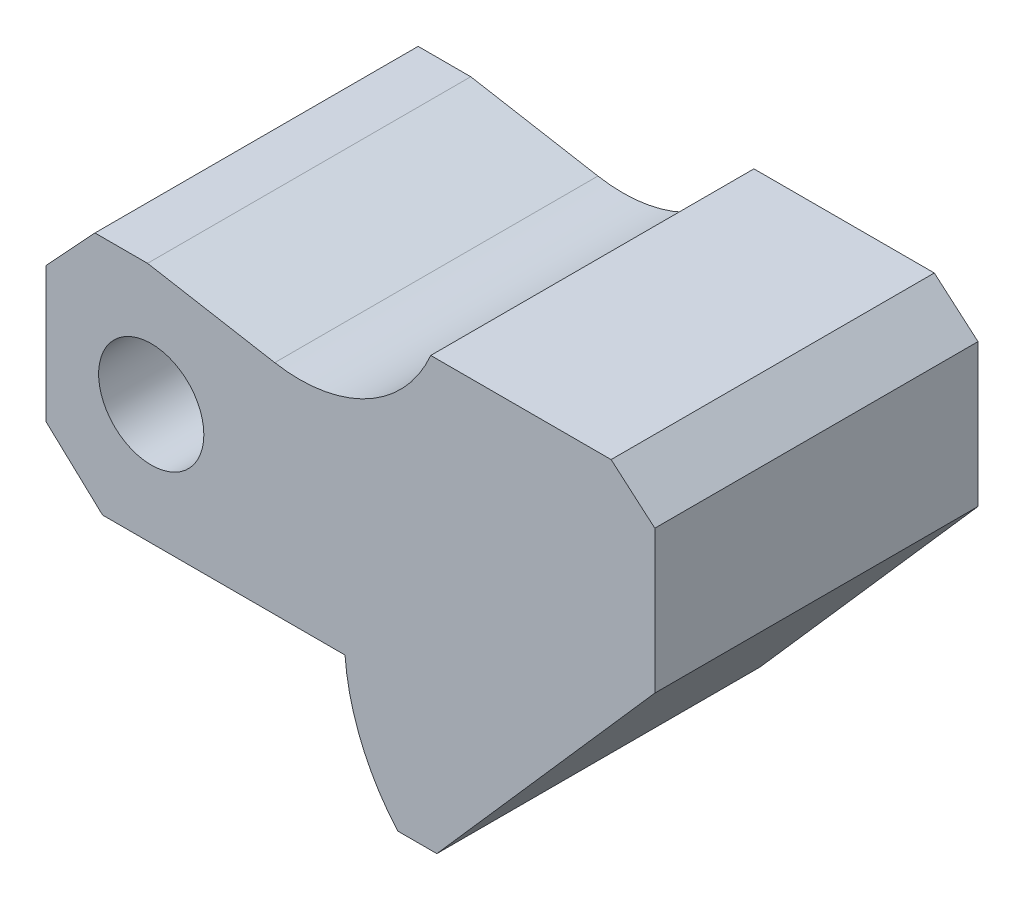
ISO-10303-21;
HEADER;
FILE_DESCRIPTION(('STEP AP214'),'2;1');
FILE_NAME('part.step','',(''),(''),'','','');
FILE_SCHEMA(('AUTOMOTIVE_DESIGN { 1 0 10303 214 1 1 1 1 }'));
ENDSEC;
DATA;
#1=APPLICATION_CONTEXT('core data for automotive mechanical design processes');
#2=APPLICATION_PROTOCOL_DEFINITION('international standard','automotive_design',2000,#1);
#3=PRODUCT_CONTEXT('',#1,'mechanical');
#4=PRODUCT('Part','Part','',(#3));
#5=PRODUCT_RELATED_PRODUCT_CATEGORY('part','',(#4));
#6=PRODUCT_DEFINITION_FORMATION('','',#4);
#7=PRODUCT_DEFINITION_CONTEXT('part definition',#1,'design');
#8=PRODUCT_DEFINITION('design','',#6,#7);
#9=PRODUCT_DEFINITION_SHAPE('','',#8);
#10=(LENGTH_UNIT() NAMED_UNIT(*) SI_UNIT(.MILLI.,.METRE.));
#11=(NAMED_UNIT(*) PLANE_ANGLE_UNIT() SI_UNIT($,.RADIAN.));
#12=(NAMED_UNIT(*) SI_UNIT($,.STERADIAN.) SOLID_ANGLE_UNIT());
#13=UNCERTAINTY_MEASURE_WITH_UNIT(LENGTH_MEASURE(1.E-05),#10,'distance_accuracy_value','');
#14=(GEOMETRIC_REPRESENTATION_CONTEXT(3) GLOBAL_UNCERTAINTY_ASSIGNED_CONTEXT((#13)) GLOBAL_UNIT_ASSIGNED_CONTEXT((#10,
#11,#12)) REPRESENTATION_CONTEXT('',''));
#15=CARTESIAN_POINT('',(0.,0.,0.));
#16=DIRECTION('',(0.,0.,1.));
#17=DIRECTION('',(1.,0.,0.));
#18=AXIS2_PLACEMENT_3D('',#15,#16,#17);
#19=CARTESIAN_POINT('',(0.,-12.1442865758826,43.));
#20=DIRECTION('',(0.,1.,0.));
#21=DIRECTION('',(-1.,0.,0.));
#22=AXIS2_PLACEMENT_3D('',#19,#20,#21);
#23=PLANE('',#22);
#24=DIRECTION('',(1.,0.,0.));
#25=VECTOR('',#24,1.);
#26=CARTESIAN_POINT('',(0.,-12.1442865758826,0.));
#27=LINE('',#26,#25);
#28=CARTESIAN_POINT('',(-18.7662638719274,-12.1442865758826,0.));
#29=VERTEX_POINT('',#28);
#30=CARTESIAN_POINT('',(13.4919473188051,-12.1442865758826,0.));
#31=VERTEX_POINT('',#30);
#32=EDGE_CURVE('E178',#29,#31,#27,.T.);
#33=ORIENTED_EDGE('',*,*,#32,.T.);
#34=DIRECTION('',(0.,0.,-1.));
#35=VECTOR('',#34,1.);
#36=CARTESIAN_POINT('',(13.4919473188051,-12.1442865758826,43.));
#37=LINE('',#36,#35);
#38=CARTESIAN_POINT('',(13.4919473188051,-12.1442865758826,43.));
#39=VERTEX_POINT('',#38);
#40=EDGE_CURVE('E11',#39,#31,#37,.T.);
#41=ORIENTED_EDGE('',*,*,#40,.F.);
#42=DIRECTION('',(1.,0.,0.));
#43=VECTOR('',#42,1.);
#44=CARTESIAN_POINT('',(0.,-12.1442865758826,43.));
#45=LINE('',#44,#43);
#46=CARTESIAN_POINT('',(-18.7662638719274,-12.1442865758826,43.));
#47=VERTEX_POINT('',#46);
#48=EDGE_CURVE('E279',#47,#39,#45,.T.);
#49=ORIENTED_EDGE('',*,*,#48,.F.);
#50=DIRECTION('',(0.,0.,-1.));
#51=VECTOR('',#50,1.);
#52=CARTESIAN_POINT('',(-18.7662638719274,-12.1442865758826,43.));
#53=LINE('',#52,#51);
#54=EDGE_CURVE('E173',#47,#29,#53,.T.);
#55=ORIENTED_EDGE('',*,*,#54,.T.);
#56=EDGE_LOOP('',(#33,#41,#49,#55));
#57=FACE_BOUND('',#56,.T.);
#58=ADVANCED_FACE('F39',(#57),#23,.F.);
#59=CARTESIAN_POINT('',(42.4064566584593,-9.91916868079168,43.));
#60=DIRECTION('',(0.,0.,-1.));
#61=DIRECTION('',(-1.,0.,0.));
#62=AXIS2_PLACEMENT_3D('',#59,#60,#61);
#63=CYLINDRICAL_SURFACE('',#62,29.);
#64=CARTESIAN_POINT('',(42.4064566584593,-9.91916868079168,0.));
#65=DIRECTION('',(0.,0.,1.));
#66=DIRECTION('',(1.,0.,0.));
#67=AXIS2_PLACEMENT_3D('',#64,#65,#66);
#68=CIRCLE('',#67,29.);
#69=CARTESIAN_POINT('',(20.4975543582526,-28.9191686807917,0.));
#70=VERTEX_POINT('',#69);
#71=EDGE_CURVE('E182',#31,#70,#68,.T.);
#72=ORIENTED_EDGE('',*,*,#71,.T.);
#73=DIRECTION('',(0.,0.,-1.));
#74=VECTOR('',#73,1.);
#75=CARTESIAN_POINT('',(20.4975543582526,-28.9191686807917,43.));
#76=LINE('',#75,#74);
#77=CARTESIAN_POINT('',(20.4975543582526,-28.9191686807917,43.));
#78=VERTEX_POINT('',#77);
#79=EDGE_CURVE('E49',#78,#70,#76,.T.);
#80=ORIENTED_EDGE('',*,*,#79,.F.);
#81=CARTESIAN_POINT('',(42.4064566584593,-9.91916868079168,43.));
#82=DIRECTION('',(0.,0.,1.));
#83=DIRECTION('',(1.,0.,0.));
#84=AXIS2_PLACEMENT_3D('',#81,#82,#83);
#85=CIRCLE('',#84,29.);
#86=EDGE_CURVE('E114',#39,#78,#85,.T.);
#87=ORIENTED_EDGE('',*,*,#86,.F.);
#88=ORIENTED_EDGE('',*,*,#40,.T.);
#89=EDGE_LOOP('',(#72,#80,#87,#88));
#90=FACE_BOUND('',#89,.T.);
#91=ADVANCED_FACE('F258',(#90),#63,.T.);
#92=CARTESIAN_POINT('',(0.,-28.9191686807917,43.));
#93=DIRECTION('',(0.,-1.,0.));
#94=DIRECTION('',(0.,0.,-1.));
#95=AXIS2_PLACEMENT_3D('',#92,#93,#94);
#96=PLANE('',#95);
#97=DIRECTION('',(-1.,0.,0.));
#98=VECTOR('',#97,1.);
#99=CARTESIAN_POINT('',(0.,-28.9191686807917,0.));
#100=LINE('',#99,#98);
#101=CARTESIAN_POINT('',(25.7094869614896,-28.9191686807917,0.));
#102=VERTEX_POINT('',#101);
#103=EDGE_CURVE('E186',#102,#70,#100,.T.);
#104=ORIENTED_EDGE('',*,*,#103,.F.);
#105=DIRECTION('',(0.,0.,-1.));
#106=VECTOR('',#105,1.);
#107=CARTESIAN_POINT('',(25.7094869614896,-28.9191686807917,43.));
#108=LINE('',#107,#106);
#109=CARTESIAN_POINT('',(25.7094869614896,-28.9191686807917,43.));
#110=VERTEX_POINT('',#109);
#111=EDGE_CURVE('E249',#110,#102,#108,.T.);
#112=ORIENTED_EDGE('',*,*,#111,.F.);
#113=DIRECTION('',(-1.,0.,0.));
#114=VECTOR('',#113,1.);
#115=CARTESIAN_POINT('',(0.,-28.9191686807917,43.));
#116=LINE('',#115,#114);
#117=EDGE_CURVE('E257',#110,#78,#116,.T.);
#118=ORIENTED_EDGE('',*,*,#117,.T.);
#119=ORIENTED_EDGE('',*,*,#79,.T.);
#120=EDGE_LOOP('',(#104,#112,#118,#119));
#121=FACE_BOUND('',#120,.T.);
#122=ADVANCED_FACE('F255',(#121),#96,.T.);
#123=CARTESIAN_POINT('',(28.8462568541864,-25.3497408718608,43.));
#124=DIRECTION('',(0.751164898449876,-0.660114607728679,0.));
#125=DIRECTION('',(0.660114607728679,0.751164898449876,0.));
#126=AXIS2_PLACEMENT_3D('',#123,#124,#125);
#127=PLANE('',#126);
#128=DIRECTION('',(-0.660114607728679,-0.751164898449876,0.));
#129=VECTOR('',#128,1.);
#130=CARTESIAN_POINT('',(28.8462568541864,-25.3497408718608,0.));
#131=LINE('',#130,#129);
#132=CARTESIAN_POINT('',(54.7094869614896,4.08083131920833,0.));
#133=VERTEX_POINT('',#132);
#134=EDGE_CURVE('E190',#133,#102,#131,.T.);
#135=ORIENTED_EDGE('',*,*,#134,.F.);
#136=DIRECTION('',(0.,0.,-1.));
#137=VECTOR('',#136,1.);
#138=CARTESIAN_POINT('',(54.7094869614896,4.08083131920833,43.));
#139=LINE('',#138,#137);
#140=CARTESIAN_POINT('',(54.7094869614896,4.08083131920833,43.));
#141=VERTEX_POINT('',#140);
#142=EDGE_CURVE('E246',#141,#133,#139,.T.);
#143=ORIENTED_EDGE('',*,*,#142,.F.);
#144=DIRECTION('',(-0.660114607728679,-0.751164898449876,0.));
#145=VECTOR('',#144,1.);
#146=CARTESIAN_POINT('',(28.8462568541864,-25.3497408718608,43.));
#147=LINE('',#146,#145);
#148=EDGE_CURVE('E270',#141,#110,#147,.T.);
#149=ORIENTED_EDGE('',*,*,#148,.T.);
#150=ORIENTED_EDGE('',*,*,#111,.T.);
#151=EDGE_LOOP('',(#135,#143,#149,#150));
#152=FACE_BOUND('',#151,.T.);
#153=ADVANCED_FACE('F267',(#152),#127,.T.);
#154=CARTESIAN_POINT('',(54.7094869614896,0.,43.));
#155=DIRECTION('',(1.,0.,0.));
#156=DIRECTION('',(0.,0.,-1.));
#157=AXIS2_PLACEMENT_3D('',#154,#155,#156);
#158=PLANE('',#157);
#159=DIRECTION('',(0.,-1.,0.));
#160=VECTOR('',#159,1.);
#161=CARTESIAN_POINT('',(54.7094869614896,0.,0.));
#162=LINE('',#161,#160);
#163=CARTESIAN_POINT('',(54.7094869614896,23.0808313192083,0.));
#164=VERTEX_POINT('',#163);
#165=EDGE_CURVE('E194',#164,#133,#162,.T.);
#166=ORIENTED_EDGE('',*,*,#165,.F.);
#167=DIRECTION('',(0.,0.,-1.));
#168=VECTOR('',#167,1.);
#169=CARTESIAN_POINT('',(54.7094869614896,23.0808313192083,43.));
#170=LINE('',#169,#168);
#171=CARTESIAN_POINT('',(54.7094869614896,23.0808313192083,43.));
#172=VERTEX_POINT('',#171);
#173=EDGE_CURVE('E243',#172,#164,#170,.T.);
#174=ORIENTED_EDGE('',*,*,#173,.F.);
#175=DIRECTION('',(0.,-1.,0.));
#176=VECTOR('',#175,1.);
#177=CARTESIAN_POINT('',(54.7094869614896,0.,43.));
#178=LINE('',#177,#176);
#179=EDGE_CURVE('E277',#172,#141,#178,.T.);
#180=ORIENTED_EDGE('',*,*,#179,.T.);
#181=ORIENTED_EDGE('',*,*,#142,.T.);
#182=EDGE_LOOP('',(#166,#174,#180,#181));
#183=FACE_BOUND('',#182,.T.);
#184=ADVANCED_FACE('F328',(#183),#158,.T.);
#185=CARTESIAN_POINT('',(34.6763728894969,40.3129186319679,43.));
#186=DIRECTION('',(-0.652117780038028,-0.758117669599037,0.));
#187=DIRECTION('',(0.758117669599037,-0.652117780038028,0.));
#188=AXIS2_PLACEMENT_3D('',#185,#186,#187);
#189=PLANE('',#188);
#190=DIRECTION('',(-0.758117669599037,0.652117780038028,0.));
#191=VECTOR('',#190,1.);
#192=CARTESIAN_POINT('',(34.6763728894969,40.3129186319679,0.));
#193=LINE('',#192,#191);
#194=CARTESIAN_POINT('',(48.8967511888595,28.0808313192083,0.));
#195=VERTEX_POINT('',#194);
#196=EDGE_CURVE('E198',#164,#195,#193,.T.);
#197=ORIENTED_EDGE('',*,*,#196,.T.);
#198=DIRECTION('',(0.,0.,-1.));
#199=VECTOR('',#198,1.);
#200=CARTESIAN_POINT('',(48.8967511888595,28.0808313192083,43.));
#201=LINE('',#200,#199);
#202=CARTESIAN_POINT('',(48.8967511888595,28.0808313192083,43.));
#203=VERTEX_POINT('',#202);
#204=EDGE_CURVE('E239',#203,#195,#201,.T.);
#205=ORIENTED_EDGE('',*,*,#204,.F.);
#206=DIRECTION('',(-0.758117669599037,0.652117780038028,0.));
#207=VECTOR('',#206,1.);
#208=CARTESIAN_POINT('',(34.6763728894969,40.3129186319679,43.));
#209=LINE('',#208,#207);
#210=EDGE_CURVE('E285',#172,#203,#209,.T.);
#211=ORIENTED_EDGE('',*,*,#210,.F.);
#212=ORIENTED_EDGE('',*,*,#173,.T.);
#213=EDGE_LOOP('',(#197,#205,#211,#212));
#214=FACE_BOUND('',#213,.T.);
#215=ADVANCED_FACE('F331',(#214),#189,.F.);
#216=CARTESIAN_POINT('',(0.,28.0808313192083,43.));
#217=DIRECTION('',(0.,-1.,0.));
#218=DIRECTION('',(0.,0.,-1.));
#219=AXIS2_PLACEMENT_3D('',#216,#217,#218);
#220=PLANE('',#219);
#221=DIRECTION('',(-1.,0.,0.));
#222=VECTOR('',#221,1.);
#223=CARTESIAN_POINT('',(0.,28.0808313192083,0.));
#224=LINE('',#223,#222);
#225=CARTESIAN_POINT('',(24.8967511888595,28.0808313192083,0.));
#226=VERTEX_POINT('',#225);
#227=EDGE_CURVE('E201',#195,#226,#224,.T.);
#228=ORIENTED_EDGE('',*,*,#227,.T.);
#229=DIRECTION('',(0.,0.,-1.));
#230=VECTOR('',#229,1.);
#231=CARTESIAN_POINT('',(24.8967511888595,28.0808313192083,43.));
#232=LINE('',#231,#230);
#233=CARTESIAN_POINT('',(24.8967511888595,28.0808313192083,43.));
#234=VERTEX_POINT('',#233);
#235=EDGE_CURVE('E236',#234,#226,#232,.T.);
#236=ORIENTED_EDGE('',*,*,#235,.F.);
#237=DIRECTION('',(-1.,0.,0.));
#238=VECTOR('',#237,1.);
#239=CARTESIAN_POINT('',(0.,28.0808313192083,43.));
#240=LINE('',#239,#238);
#241=EDGE_CURVE('E288',#203,#234,#240,.T.);
#242=ORIENTED_EDGE('',*,*,#241,.F.);
#243=ORIENTED_EDGE('',*,*,#204,.T.);
#244=EDGE_LOOP('',(#228,#236,#242,#243));
#245=FACE_BOUND('',#244,.T.);
#246=ADVANCED_FACE('F335',(#245),#220,.F.);
#247=CARTESIAN_POINT('',(7.44087013271377,35.5836452282489,43.));
#248=DIRECTION('',(0.,0.,-1.));
#249=DIRECTION('',(-1.,0.,0.));
#250=AXIS2_PLACEMENT_3D('',#247,#248,#249);
#251=CYLINDRICAL_SURFACE('',#250,19.);
#252=CARTESIAN_POINT('',(7.44087013271377,35.5836452282489,0.));
#253=DIRECTION('',(0.,0.,1.));
#254=DIRECTION('',(1.,0.,0.));
#255=AXIS2_PLACEMENT_3D('',#252,#253,#254);
#256=CIRCLE('',#255,19.);
#257=CARTESIAN_POINT('',(4.14155475704207,16.872297921017,0.));
#258=VERTEX_POINT('',#257);
#259=EDGE_CURVE('E205',#258,#226,#256,.T.);
#260=ORIENTED_EDGE('',*,*,#259,.F.);
#261=DIRECTION('',(0.,0.,-1.));
#262=VECTOR('',#261,1.);
#263=CARTESIAN_POINT('',(4.14155475704207,16.872297921017,43.));
#264=LINE('',#263,#262);
#265=CARTESIAN_POINT('',(4.14155475704207,16.872297921017,43.));
#266=VERTEX_POINT('',#265);
#267=EDGE_CURVE('E233',#266,#258,#264,.T.);
#268=ORIENTED_EDGE('',*,*,#267,.F.);
#269=CARTESIAN_POINT('',(7.44087013271377,35.5836452282489,43.));
#270=DIRECTION('',(0.,0.,1.));
#271=DIRECTION('',(1.,0.,0.));
#272=AXIS2_PLACEMENT_3D('',#269,#270,#271);
#273=CIRCLE('',#272,19.);
#274=EDGE_CURVE('E291',#266,#234,#273,.T.);
#275=ORIENTED_EDGE('',*,*,#274,.T.);
#276=ORIENTED_EDGE('',*,*,#235,.T.);
#277=EDGE_LOOP('',(#260,#268,#275,#276));
#278=FACE_BOUND('',#277,.T.);
#279=ADVANCED_FACE('F339',(#278),#251,.F.);
#280=CARTESIAN_POINT('',(3.01021603322426,17.0717834623464,43.));
#281=DIRECTION('',(0.173648177666931,0.984807753012208,0.));
#282=DIRECTION('',(-0.984807753012208,0.173648177666931,0.));
#283=AXIS2_PLACEMENT_3D('',#280,#281,#282);
#284=PLANE('',#283);
#285=DIRECTION('',(0.984807753012208,-0.173648177666931,0.));
#286=VECTOR('',#285,1.);
#287=CARTESIAN_POINT('',(3.01021603322426,17.0717834623464,0.));
#288=LINE('',#287,#286);
#289=CARTESIAN_POINT('',(-12.778235346057,19.8557134241174,0.));
#290=VERTEX_POINT('',#289);
#291=EDGE_CURVE('E209',#290,#258,#288,.T.);
#292=ORIENTED_EDGE('',*,*,#291,.F.);
#293=DIRECTION('',(0.,0.,-1.));
#294=VECTOR('',#293,1.);
#295=CARTESIAN_POINT('',(-12.778235346057,19.8557134241174,43.));
#296=LINE('',#295,#294);
#297=CARTESIAN_POINT('',(-12.778235346057,19.8557134241174,43.));
#298=VERTEX_POINT('',#297);
#299=EDGE_CURVE('E230',#298,#290,#296,.T.);
#300=ORIENTED_EDGE('',*,*,#299,.F.);
#301=DIRECTION('',(0.984807753012208,-0.173648177666931,0.));
#302=VECTOR('',#301,1.);
#303=CARTESIAN_POINT('',(3.01021603322426,17.0717834623464,43.));
#304=LINE('',#303,#302);
#305=EDGE_CURVE('E167',#298,#266,#304,.T.);
#306=ORIENTED_EDGE('',*,*,#305,.T.);
#307=ORIENTED_EDGE('',*,*,#267,.T.);
#308=EDGE_LOOP('',(#292,#300,#306,#307));
#309=FACE_BOUND('',#308,.T.);
#310=ADVANCED_FACE('F298',(#309),#284,.T.);
#311=CARTESIAN_POINT('',(0.,19.8557134241175,43.));
#312=DIRECTION('',(0.,1.,0.));
#313=DIRECTION('',(-1.,0.,0.));
#314=AXIS2_PLACEMENT_3D('',#311,#312,#313);
#315=PLANE('',#314);
#316=DIRECTION('',(1.,0.,0.));
#317=VECTOR('',#316,1.);
#318=CARTESIAN_POINT('',(0.,19.8557134241175,0.));
#319=LINE('',#318,#317);
#320=CARTESIAN_POINT('',(-19.778235346057,19.8557134241174,0.));
#321=VERTEX_POINT('',#320);
#322=EDGE_CURVE('E213',#321,#290,#319,.T.);
#323=ORIENTED_EDGE('',*,*,#322,.F.);
#324=DIRECTION('',(0.,0.,-1.));
#325=VECTOR('',#324,1.);
#326=CARTESIAN_POINT('',(-19.778235346057,19.8557134241174,43.));
#327=LINE('',#326,#325);
#328=CARTESIAN_POINT('',(-19.778235346057,19.8557134241174,43.));
#329=VERTEX_POINT('',#328);
#330=EDGE_CURVE('E152',#329,#321,#327,.T.);
#331=ORIENTED_EDGE('',*,*,#330,.F.);
#332=DIRECTION('',(1.,0.,0.));
#333=VECTOR('',#332,1.);
#334=CARTESIAN_POINT('',(0.,19.8557134241175,43.));
#335=LINE('',#334,#333);
#336=EDGE_CURVE('E163',#329,#298,#335,.T.);
#337=ORIENTED_EDGE('',*,*,#336,.T.);
#338=ORIENTED_EDGE('',*,*,#299,.T.);
#339=EDGE_LOOP('',(#323,#331,#337,#338));
#340=FACE_BOUND('',#339,.T.);
#341=ADVANCED_FACE('F303',(#340),#315,.T.);
#342=CARTESIAN_POINT('',(-20.504101027142,19.0754856746954,43.));
#343=DIRECTION('',(-0.732152844338103,0.681140376521334,0.));
#344=DIRECTION('',(-0.681140376521334,-0.732152844338103,0.));
#345=AXIS2_PLACEMENT_3D('',#342,#343,#344);
#346=PLANE('',#345);
#347=DIRECTION('',(0.681140376521334,0.732152844338104,0.));
#348=VECTOR('',#347,1.);
#349=CARTESIAN_POINT('',(-20.504101027142,19.0754856746954,0.));
#350=LINE('',#349,#348);
#351=CARTESIAN_POINT('',(-26.2905130385104,12.8557134241174,0.));
#352=VERTEX_POINT('',#351);
#353=EDGE_CURVE('E150',#352,#321,#350,.T.);
#354=ORIENTED_EDGE('',*,*,#353,.F.);
#355=DIRECTION('',(0.,0.,-1.));
#356=VECTOR('',#355,1.);
#357=CARTESIAN_POINT('',(-26.2905130385104,12.8557134241174,43.));
#358=LINE('',#357,#356);
#359=CARTESIAN_POINT('',(-26.2905130385104,12.8557134241174,43.));
#360=VERTEX_POINT('',#359);
#361=EDGE_CURVE('E144',#360,#352,#358,.T.);
#362=ORIENTED_EDGE('',*,*,#361,.F.);
#363=DIRECTION('',(0.681140376521334,0.732152844338104,0.));
#364=VECTOR('',#363,1.);
#365=CARTESIAN_POINT('',(-20.504101027142,19.0754856746954,43.));
#366=LINE('',#365,#364);
#367=EDGE_CURVE('E148',#360,#329,#366,.T.);
#368=ORIENTED_EDGE('',*,*,#367,.T.);
#369=ORIENTED_EDGE('',*,*,#330,.T.);
#370=EDGE_LOOP('',(#354,#362,#368,#369));
#371=FACE_BOUND('',#370,.T.);
#372=ADVANCED_FACE('F146',(#371),#346,.T.);
#373=CARTESIAN_POINT('',(-26.2905130385104,0.,43.));
#374=DIRECTION('',(1.,0.,0.));
#375=DIRECTION('',(0.,0.,-1.));
#376=AXIS2_PLACEMENT_3D('',#373,#374,#375);
#377=PLANE('',#376);
#378=DIRECTION('',(0.,-1.,0.));
#379=VECTOR('',#378,1.);
#380=CARTESIAN_POINT('',(-26.2905130385104,0.,0.));
#381=LINE('',#380,#379);
#382=CARTESIAN_POINT('',(-26.2905130385104,-5.14428657588256,0.));
#383=VERTEX_POINT('',#382);
#384=EDGE_CURVE('E100',#352,#383,#381,.T.);
#385=ORIENTED_EDGE('',*,*,#384,.T.);
#386=DIRECTION('',(0.,0.,-1.));
#387=VECTOR('',#386,1.);
#388=CARTESIAN_POINT('',(-26.2905130385104,-5.14428657588256,43.));
#389=LINE('',#388,#387);
#390=CARTESIAN_POINT('',(-26.2905130385104,-5.14428657588256,43.));
#391=VERTEX_POINT('',#390);
#392=EDGE_CURVE('E153',#391,#383,#389,.T.);
#393=ORIENTED_EDGE('',*,*,#392,.F.);
#394=DIRECTION('',(0.,-1.,0.));
#395=VECTOR('',#394,1.);
#396=CARTESIAN_POINT('',(-26.2905130385104,0.,43.));
#397=LINE('',#396,#395);
#398=EDGE_CURVE('E155',#360,#391,#397,.T.);
#399=ORIENTED_EDGE('',*,*,#398,.F.);
#400=ORIENTED_EDGE('',*,*,#361,.T.);
#401=EDGE_LOOP('',(#385,#393,#399,#400));
#402=FACE_BOUND('',#401,.T.);
#403=ADVANCED_FACE('F156',(#402),#377,.F.);
#404=CARTESIAN_POINT('',(-12.2905130385104,3.85571342411744,43.));
#405=DIRECTION('',(0.,0.,-1.));
#406=DIRECTION('',(-1.,0.,0.));
#407=AXIS2_PLACEMENT_3D('',#404,#405,#406);
#408=CYLINDRICAL_SURFACE('',#407,7.);
#409=CARTESIAN_POINT('',(-12.2905130385104,3.85571342411744,43.));
#410=DIRECTION('',(0.,0.,1.));
#411=DIRECTION('',(1.,0.,0.));
#412=AXIS2_PLACEMENT_3D('',#409,#410,#411);
#413=CIRCLE('',#412,7.);
#414=CARTESIAN_POINT('',(-5.29051303851043,3.85571342411744,43.));
#415=VERTEX_POINT('',#414);
#416=EDGE_CURVE('E223',#415,#415,#413,.T.);
#417=ORIENTED_EDGE('',*,*,#416,.T.);
#418=EDGE_LOOP('',(#417));
#419=FACE_BOUND('',#418,.T.);
#420=CARTESIAN_POINT('',(-12.2905130385104,3.85571342411744,0.));
#421=DIRECTION('',(0.,0.,1.));
#422=DIRECTION('',(1.,0.,0.));
#423=AXIS2_PLACEMENT_3D('',#420,#421,#422);
#424=CIRCLE('',#423,7.);
#425=CARTESIAN_POINT('',(-5.29051303851043,3.85571342411744,0.));
#426=VERTEX_POINT('',#425);
#427=EDGE_CURVE('E174',#426,#426,#424,.T.);
#428=ORIENTED_EDGE('',*,*,#427,.F.);
#429=EDGE_LOOP('',(#428));
#430=FACE_BOUND('',#429,.T.);
#431=ADVANCED_FACE('F41',(#419,#430),#408,.F.);
#432=CARTESIAN_POINT('',(-14.7629915645137,-15.8686324250807,43.));
#433=DIRECTION('',(0.681140376521334,0.732152844338103,0.));
#434=DIRECTION('',(-0.732152844338103,0.681140376521334,0.));
#435=AXIS2_PLACEMENT_3D('',#432,#433,#434);
#436=PLANE('',#435);
#437=DIRECTION('',(0.732152844338103,-0.681140376521334,0.));
#438=VECTOR('',#437,1.);
#439=CARTESIAN_POINT('',(-14.7629915645137,-15.8686324250807,0.));
#440=LINE('',#439,#438);
#441=EDGE_CURVE('E106',#383,#29,#440,.T.);
#442=ORIENTED_EDGE('',*,*,#441,.T.);
#443=ORIENTED_EDGE('',*,*,#54,.F.);
#444=DIRECTION('',(0.732152844338103,-0.681140376521334,0.));
#445=VECTOR('',#444,1.);
#446=CARTESIAN_POINT('',(-14.7629915645137,-15.8686324250807,43.));
#447=LINE('',#446,#445);
#448=EDGE_CURVE('E57',#391,#47,#447,.T.);
#449=ORIENTED_EDGE('',*,*,#448,.F.);
#450=ORIENTED_EDGE('',*,*,#392,.T.);
#451=EDGE_LOOP('',(#442,#443,#449,#450));
#452=FACE_BOUND('',#451,.T.);
#453=ADVANCED_FACE('F306',(#452),#436,.F.);
#454=CARTESIAN_POINT('',(0.,0.,43.));
#455=DIRECTION('',(0.,0.,1.));
#456=DIRECTION('',(1.,0.,0.));
#457=AXIS2_PLACEMENT_3D('',#454,#455,#456);
#458=PLANE('',#457);
#459=ORIENTED_EDGE('',*,*,#416,.F.);
#460=EDGE_LOOP('',(#459));
#461=FACE_BOUND('',#460,.T.);
#462=ORIENTED_EDGE('',*,*,#48,.T.);
#463=ORIENTED_EDGE('',*,*,#86,.T.);
#464=ORIENTED_EDGE('',*,*,#117,.F.);
#465=ORIENTED_EDGE('',*,*,#148,.F.);
#466=ORIENTED_EDGE('',*,*,#179,.F.);
#467=ORIENTED_EDGE('',*,*,#210,.T.);
#468=ORIENTED_EDGE('',*,*,#241,.T.);
#469=ORIENTED_EDGE('',*,*,#274,.F.);
#470=ORIENTED_EDGE('',*,*,#305,.F.);
#471=ORIENTED_EDGE('',*,*,#336,.F.);
#472=ORIENTED_EDGE('',*,*,#367,.F.);
#473=ORIENTED_EDGE('',*,*,#398,.T.);
#474=ORIENTED_EDGE('',*,*,#448,.T.);
#475=EDGE_LOOP('',(#462,#463,#464,#465,#466,#467,#468,#469,#470,#471,#472,#473,#474));
#476=FACE_BOUND('',#475,.T.);
#477=ADVANCED_FACE('F160',(#461,#476),#458,.T.);
#478=CARTESIAN_POINT('',(0.,0.,0.));
#479=DIRECTION('',(0.,0.,1.));
#480=DIRECTION('',(1.,0.,0.));
#481=AXIS2_PLACEMENT_3D('',#478,#479,#480);
#482=PLANE('',#481);
#483=ORIENTED_EDGE('',*,*,#427,.T.);
#484=EDGE_LOOP('',(#483));
#485=FACE_BOUND('',#484,.T.);
#486=ORIENTED_EDGE('',*,*,#32,.F.);
#487=ORIENTED_EDGE('',*,*,#441,.F.);
#488=ORIENTED_EDGE('',*,*,#384,.F.);
#489=ORIENTED_EDGE('',*,*,#353,.T.);
#490=ORIENTED_EDGE('',*,*,#322,.T.);
#491=ORIENTED_EDGE('',*,*,#291,.T.);
#492=ORIENTED_EDGE('',*,*,#259,.T.);
#493=ORIENTED_EDGE('',*,*,#227,.F.);
#494=ORIENTED_EDGE('',*,*,#196,.F.);
#495=ORIENTED_EDGE('',*,*,#165,.T.);
#496=ORIENTED_EDGE('',*,*,#134,.T.);
#497=ORIENTED_EDGE('',*,*,#103,.T.);
#498=ORIENTED_EDGE('',*,*,#71,.F.);
#499=EDGE_LOOP('',(#486,#487,#488,#489,#490,#491,#492,#493,#494,#495,#496,#497,#498));
#500=FACE_BOUND('',#499,.T.);
#501=ADVANCED_FACE('F262',(#485,#500),#482,.F.);
#502=CLOSED_SHELL('',(#58,#91,#122,#153,#184,#215,#246,#279,#310,#341,#372,#403,#431,#453,#477,#501));
#503=MANIFOLD_SOLID_BREP('B2',#502);
#504=ADVANCED_BREP_SHAPE_REPRESENTATION('',(#18,#503),#14);
#505=SHAPE_DEFINITION_REPRESENTATION(#9,#504);
ENDSEC;
END-ISO-10303-21;
